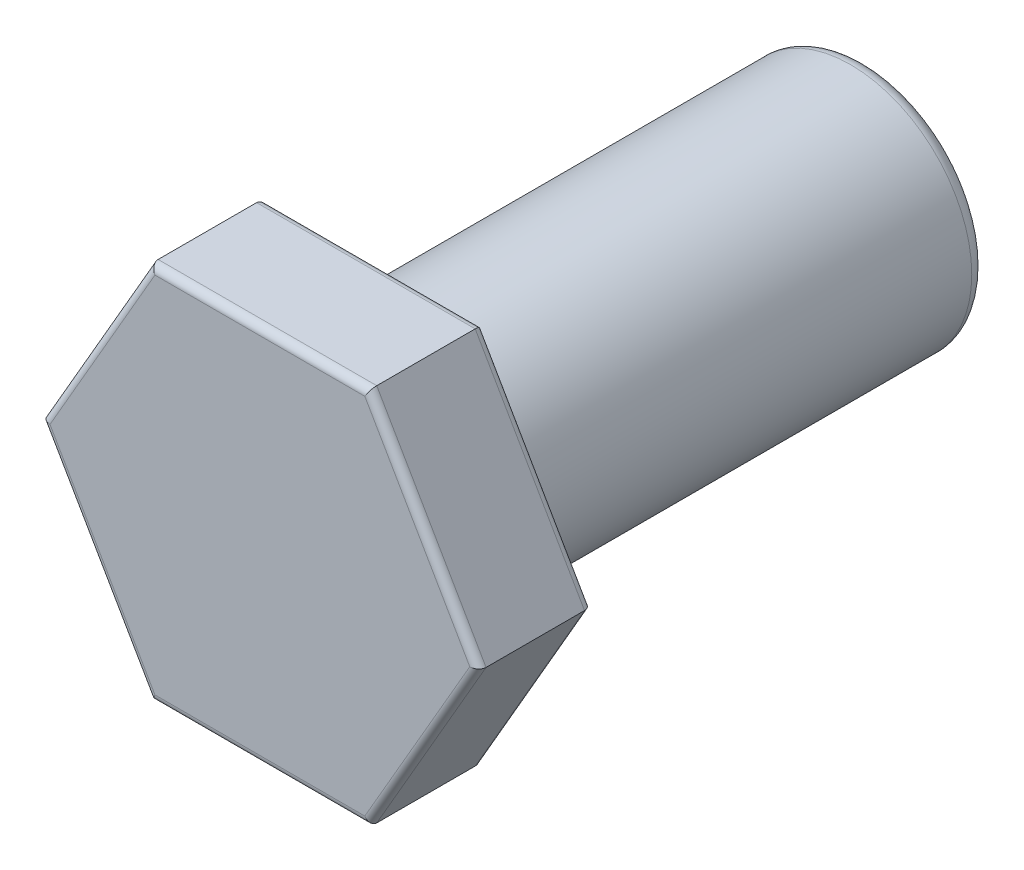
ISO-10303-21;
HEADER;
FILE_DESCRIPTION(('STEP AP214'),'2;1');
FILE_NAME('part.step','',(''),(''),'','','');
FILE_SCHEMA(('AUTOMOTIVE_DESIGN { 1 0 10303 214 1 1 1 1 }'));
ENDSEC;
DATA;
#1=APPLICATION_CONTEXT('core data for automotive mechanical design processes');
#2=APPLICATION_PROTOCOL_DEFINITION('international standard','automotive_design',2000,#1);
#3=PRODUCT_CONTEXT('',#1,'mechanical');
#4=PRODUCT('Part','Part','',(#3));
#5=PRODUCT_RELATED_PRODUCT_CATEGORY('part','',(#4));
#6=PRODUCT_DEFINITION_FORMATION('','',#4);
#7=PRODUCT_DEFINITION_CONTEXT('part definition',#1,'design');
#8=PRODUCT_DEFINITION('design','',#6,#7);
#9=PRODUCT_DEFINITION_SHAPE('','',#8);
#10=(LENGTH_UNIT() NAMED_UNIT(*) SI_UNIT(.MILLI.,.METRE.));
#11=(NAMED_UNIT(*) PLANE_ANGLE_UNIT() SI_UNIT($,.RADIAN.));
#12=(NAMED_UNIT(*) SI_UNIT($,.STERADIAN.) SOLID_ANGLE_UNIT());
#13=UNCERTAINTY_MEASURE_WITH_UNIT(LENGTH_MEASURE(1.E-05),#10,'distance_accuracy_value','');
#14=(GEOMETRIC_REPRESENTATION_CONTEXT(3) GLOBAL_UNCERTAINTY_ASSIGNED_CONTEXT((#13)) GLOBAL_UNIT_ASSIGNED_CONTEXT((#10,
#11,#12)) REPRESENTATION_CONTEXT('',''));
#15=CARTESIAN_POINT('',(0.,0.,0.));
#16=DIRECTION('',(0.,0.,1.));
#17=DIRECTION('',(1.,0.,0.));
#18=AXIS2_PLACEMENT_3D('',#15,#16,#17);
#19=CARTESIAN_POINT('',(0.,0.,32.5));
#20=DIRECTION('',(0.,0.,-1.));
#21=DIRECTION('',(-1.,0.,0.));
#22=AXIS2_PLACEMENT_3D('',#19,#20,#21);
#23=CYLINDRICAL_SURFACE('',#22,8.);
#24=CARTESIAN_POINT('',(0.,0.,1.));
#25=DIRECTION('',(0.,0.,1.));
#26=DIRECTION('',(1.,0.,0.));
#27=AXIS2_PLACEMENT_3D('',#24,#25,#26);
#28=CIRCLE('',#27,8.);
#29=CARTESIAN_POINT('',(8.,0.,1.));
#30=VERTEX_POINT('',#29);
#31=EDGE_CURVE('E155',#30,#30,#28,.T.);
#32=ORIENTED_EDGE('',*,*,#31,.T.);
#33=EDGE_LOOP('',(#32));
#34=FACE_BOUND('',#33,.T.);
#35=CARTESIAN_POINT('',(0.,0.,32.5));
#36=DIRECTION('',(0.,0.,1.));
#37=DIRECTION('',(1.,0.,0.));
#38=AXIS2_PLACEMENT_3D('',#35,#36,#37);
#39=CIRCLE('',#38,8.);
#40=CARTESIAN_POINT('',(8.,0.,32.5));
#41=VERTEX_POINT('',#40);
#42=EDGE_CURVE('E268',#41,#41,#39,.T.);
#43=ORIENTED_EDGE('',*,*,#42,.F.);
#44=EDGE_LOOP('',(#43));
#45=FACE_BOUND('',#44,.T.);
#46=ADVANCED_FACE('F34',(#34,#45),#23,.T.);
#47=CARTESIAN_POINT('',(0.,0.,0.));
#48=DIRECTION('',(0.,0.,1.));
#49=DIRECTION('',(1.,0.,0.));
#50=AXIS2_PLACEMENT_3D('',#47,#48,#49);
#51=PLANE('',#50);
#52=CARTESIAN_POINT('',(0.,0.,0.));
#53=DIRECTION('',(0.,0.,1.));
#54=DIRECTION('',(1.,0.,0.));
#55=AXIS2_PLACEMENT_3D('',#52,#53,#54);
#56=CIRCLE('',#55,7.);
#57=CARTESIAN_POINT('',(7.,0.,0.));
#58=VERTEX_POINT('',#57);
#59=EDGE_CURVE('E151',#58,#58,#56,.F.);
#60=ORIENTED_EDGE('',*,*,#59,.T.);
#61=EDGE_LOOP('',(#60));
#62=FACE_BOUND('',#61,.T.);
#63=ADVANCED_FACE('F289',(#62),#51,.F.);
#64=CARTESIAN_POINT('',(0.,0.,32.5));
#65=DIRECTION('',(0.,0.,1.));
#66=DIRECTION('',(1.,0.,0.));
#67=AXIS2_PLACEMENT_3D('',#64,#65,#66);
#68=PLANE('',#67);
#69=DIRECTION('',(0.5,0.866025403784439,0.));
#70=VECTOR('',#69,1.);
#71=CARTESIAN_POINT('',(10.3923048454133,-6.00000000000001,32.5));
#72=LINE('',#71,#70);
#73=CARTESIAN_POINT('',(13.856406460551,0.,32.5));
#74=VERTEX_POINT('',#73);
#75=CARTESIAN_POINT('',(6.92820323027551,-12.,32.5));
#76=VERTEX_POINT('',#75);
#77=EDGE_CURVE('E183',#74,#76,#72,.F.);
#78=ORIENTED_EDGE('',*,*,#77,.T.);
#79=DIRECTION('',(1.,0.,0.));
#80=VECTOR('',#79,1.);
#81=CARTESIAN_POINT('',(0.,-12.,32.5));
#82=LINE('',#81,#80);
#83=CARTESIAN_POINT('',(-6.92820323027552,-12.,32.5));
#84=VERTEX_POINT('',#83);
#85=EDGE_CURVE('E189',#76,#84,#82,.F.);
#86=ORIENTED_EDGE('',*,*,#85,.T.);
#87=DIRECTION('',(0.5,-0.866025403784439,0.));
#88=VECTOR('',#87,1.);
#89=CARTESIAN_POINT('',(-10.3923048454133,-6.,32.5));
#90=LINE('',#89,#88);
#91=CARTESIAN_POINT('',(-13.856406460551,0.,32.5));
#92=VERTEX_POINT('',#91);
#93=EDGE_CURVE('E187',#84,#92,#90,.F.);
#94=ORIENTED_EDGE('',*,*,#93,.T.);
#95=DIRECTION('',(-0.5,-0.866025403784439,0.));
#96=VECTOR('',#95,1.);
#97=CARTESIAN_POINT('',(-10.3923048454133,6.00000000000001,32.5));
#98=LINE('',#97,#96);
#99=CARTESIAN_POINT('',(-6.92820323027552,12.,32.5));
#100=VERTEX_POINT('',#99);
#101=EDGE_CURVE('E185',#92,#100,#98,.F.);
#102=ORIENTED_EDGE('',*,*,#101,.T.);
#103=DIRECTION('',(-1.,0.,0.));
#104=VECTOR('',#103,1.);
#105=CARTESIAN_POINT('',(0.,12.,32.5));
#106=LINE('',#105,#104);
#107=CARTESIAN_POINT('',(6.92820323027551,12.,32.5));
#108=VERTEX_POINT('',#107);
#109=EDGE_CURVE('E181',#100,#108,#106,.F.);
#110=ORIENTED_EDGE('',*,*,#109,.T.);
#111=DIRECTION('',(-0.5,0.866025403784439,0.));
#112=VECTOR('',#111,1.);
#113=CARTESIAN_POINT('',(10.3923048454133,6.,32.5));
#114=LINE('',#113,#112);
#115=EDGE_CURVE('E179',#108,#74,#114,.F.);
#116=ORIENTED_EDGE('',*,*,#115,.T.);
#117=EDGE_LOOP('',(#78,#86,#94,#102,#110,#116));
#118=FACE_BOUND('',#117,.T.);
#119=ORIENTED_EDGE('',*,*,#42,.T.);
#120=EDGE_LOOP('',(#119));
#121=FACE_BOUND('',#120,.T.);
#122=ADVANCED_FACE('F233',(#118,#121),#68,.F.);
#123=CARTESIAN_POINT('',(-7.21687836487033,-12.5,40.));
#124=DIRECTION('',(0.,1.,0.));
#125=DIRECTION('',(-1.,0.,0.));
#126=AXIS2_PLACEMENT_3D('',#123,#124,#125);
#127=PLANE('',#126);
#128=DIRECTION('',(0.,0.,-1.));
#129=VECTOR('',#128,1.);
#130=CARTESIAN_POINT('',(7.21687836487032,-12.5,40.));
#131=LINE('',#130,#129);
#132=CARTESIAN_POINT('',(7.21687836487032,-12.5,39.5));
#133=VERTEX_POINT('',#132);
#134=CARTESIAN_POINT('',(7.21687836487032,-12.5,33.));
#135=VERTEX_POINT('',#134);
#136=EDGE_CURVE('E266',#133,#135,#131,.T.);
#137=ORIENTED_EDGE('',*,*,#136,.F.);
#138=DIRECTION('',(1.,0.,0.));
#139=VECTOR('',#138,1.);
#140=CARTESIAN_POINT('',(-7.21687836487033,-12.5,39.5));
#141=LINE('',#140,#139);
#142=CARTESIAN_POINT('',(-7.21687836487033,-12.5,39.5));
#143=VERTEX_POINT('',#142);
#144=EDGE_CURVE('E177',#133,#143,#141,.F.);
#145=ORIENTED_EDGE('',*,*,#144,.T.);
#146=DIRECTION('',(0.,0.,-1.));
#147=VECTOR('',#146,1.);
#148=CARTESIAN_POINT('',(-7.21687836487033,-12.5,40.));
#149=LINE('',#148,#147);
#150=CARTESIAN_POINT('',(-7.21687836487033,-12.5,33.));
#151=VERTEX_POINT('',#150);
#152=EDGE_CURVE('E144',#143,#151,#149,.T.);
#153=ORIENTED_EDGE('',*,*,#152,.T.);
#154=DIRECTION('',(1.,0.,0.));
#155=VECTOR('',#154,1.);
#156=CARTESIAN_POINT('',(-7.21687836487033,-12.5,33.));
#157=LINE('',#156,#155);
#158=EDGE_CURVE('E174',#151,#135,#157,.T.);
#159=ORIENTED_EDGE('',*,*,#158,.T.);
#160=EDGE_LOOP('',(#137,#145,#153,#159));
#161=FACE_BOUND('',#160,.T.);
#162=ADVANCED_FACE('F253',(#161),#127,.F.);
#163=CARTESIAN_POINT('',(7.21687836487032,-12.5,40.));
#164=DIRECTION('',(-0.866025403784438,0.5,0.));
#165=DIRECTION('',(-0.5,-0.866025403784439,0.));
#166=AXIS2_PLACEMENT_3D('',#163,#164,#165);
#167=PLANE('',#166);
#168=DIRECTION('',(0.,0.,-1.));
#169=VECTOR('',#168,1.);
#170=CARTESIAN_POINT('',(14.4337567297407,0.,40.));
#171=LINE('',#170,#169);
#172=CARTESIAN_POINT('',(14.4337567297407,0.,39.5));
#173=VERTEX_POINT('',#172);
#174=CARTESIAN_POINT('',(14.4337567297407,0.,33.));
#175=VERTEX_POINT('',#174);
#176=EDGE_CURVE('E264',#173,#175,#171,.T.);
#177=ORIENTED_EDGE('',*,*,#176,.F.);
#178=DIRECTION('',(0.5,0.866025403784439,0.));
#179=VECTOR('',#178,1.);
#180=CARTESIAN_POINT('',(7.21687836487032,-12.5,39.5));
#181=LINE('',#180,#179);
#182=EDGE_CURVE('E141',#173,#133,#181,.F.);
#183=ORIENTED_EDGE('',*,*,#182,.T.);
#184=ORIENTED_EDGE('',*,*,#136,.T.);
#185=DIRECTION('',(0.5,0.866025403784439,0.));
#186=VECTOR('',#185,1.);
#187=CARTESIAN_POINT('',(7.21687836487032,-12.5,33.));
#188=LINE('',#187,#186);
#189=EDGE_CURVE('E192',#135,#175,#188,.T.);
#190=ORIENTED_EDGE('',*,*,#189,.T.);
#191=EDGE_LOOP('',(#177,#183,#184,#190));
#192=FACE_BOUND('',#191,.T.);
#193=ADVANCED_FACE('F298',(#192),#167,.F.);
#194=CARTESIAN_POINT('',(14.4337567297407,0.,40.));
#195=DIRECTION('',(-0.866025403784438,-0.5,0.));
#196=DIRECTION('',(0.5,-0.866025403784439,0.));
#197=AXIS2_PLACEMENT_3D('',#194,#195,#196);
#198=PLANE('',#197);
#199=ORIENTED_EDGE('',*,*,#176,.T.);
#200=DIRECTION('',(-0.5,0.866025403784439,0.));
#201=VECTOR('',#200,1.);
#202=CARTESIAN_POINT('',(14.4337567297407,0.,33.));
#203=LINE('',#202,#201);
#204=CARTESIAN_POINT('',(7.21687836487033,12.5,33.));
#205=VERTEX_POINT('',#204);
#206=EDGE_CURVE('E11',#175,#205,#203,.T.);
#207=ORIENTED_EDGE('',*,*,#206,.T.);
#208=DIRECTION('',(0.,0.,-1.));
#209=VECTOR('',#208,1.);
#210=CARTESIAN_POINT('',(7.21687836487033,12.5,40.));
#211=LINE('',#210,#209);
#212=CARTESIAN_POINT('',(7.21687836487033,12.5,39.5));
#213=VERTEX_POINT('',#212);
#214=EDGE_CURVE('E262',#213,#205,#211,.T.);
#215=ORIENTED_EDGE('',*,*,#214,.F.);
#216=DIRECTION('',(-0.5,0.866025403784439,0.));
#217=VECTOR('',#216,1.);
#218=CARTESIAN_POINT('',(14.4337567297407,0.,39.5));
#219=LINE('',#218,#217);
#220=EDGE_CURVE('E43',#213,#173,#219,.F.);
#221=ORIENTED_EDGE('',*,*,#220,.T.);
#222=EDGE_LOOP('',(#199,#207,#215,#221));
#223=FACE_BOUND('',#222,.T.);
#224=ADVANCED_FACE('F301',(#223),#198,.F.);
#225=CARTESIAN_POINT('',(7.21687836487033,12.5,40.));
#226=DIRECTION('',(0.,-1.,0.));
#227=DIRECTION('',(1.,0.,0.));
#228=AXIS2_PLACEMENT_3D('',#225,#226,#227);
#229=PLANE('',#228);
#230=DIRECTION('',(0.,0.,-1.));
#231=VECTOR('',#230,1.);
#232=CARTESIAN_POINT('',(-7.21687836487033,12.5,40.));
#233=LINE('',#232,#231);
#234=CARTESIAN_POINT('',(-7.21687836487033,12.5,39.5));
#235=VERTEX_POINT('',#234);
#236=CARTESIAN_POINT('',(-7.21687836487033,12.5,33.));
#237=VERTEX_POINT('',#236);
#238=EDGE_CURVE('E257',#235,#237,#233,.T.);
#239=ORIENTED_EDGE('',*,*,#238,.F.);
#240=DIRECTION('',(-1.,0.,0.));
#241=VECTOR('',#240,1.);
#242=CARTESIAN_POINT('',(7.21687836487033,12.5,39.5));
#243=LINE('',#242,#241);
#244=EDGE_CURVE('E56',#235,#213,#243,.F.);
#245=ORIENTED_EDGE('',*,*,#244,.T.);
#246=ORIENTED_EDGE('',*,*,#214,.T.);
#247=DIRECTION('',(-1.,0.,0.));
#248=VECTOR('',#247,1.);
#249=CARTESIAN_POINT('',(7.21687836487033,12.5,33.));
#250=LINE('',#249,#248);
#251=EDGE_CURVE('E195',#205,#237,#250,.T.);
#252=ORIENTED_EDGE('',*,*,#251,.T.);
#253=EDGE_LOOP('',(#239,#245,#246,#252));
#254=FACE_BOUND('',#253,.T.);
#255=ADVANCED_FACE('F305',(#254),#229,.F.);
#256=CARTESIAN_POINT('',(-7.21687836487033,12.5,40.));
#257=DIRECTION('',(0.866025403784438,-0.5,0.));
#258=DIRECTION('',(0.5,0.866025403784439,0.));
#259=AXIS2_PLACEMENT_3D('',#256,#257,#258);
#260=PLANE('',#259);
#261=DIRECTION('',(0.,0.,-1.));
#262=VECTOR('',#261,1.);
#263=CARTESIAN_POINT('',(-14.4337567297407,0.,40.));
#264=LINE('',#263,#262);
#265=CARTESIAN_POINT('',(-14.4337567297407,0.,39.5));
#266=VERTEX_POINT('',#265);
#267=CARTESIAN_POINT('',(-14.4337567297407,0.,33.));
#268=VERTEX_POINT('',#267);
#269=EDGE_CURVE('E250',#266,#268,#264,.T.);
#270=ORIENTED_EDGE('',*,*,#269,.F.);
#271=DIRECTION('',(-0.5,-0.866025403784439,0.));
#272=VECTOR('',#271,1.);
#273=CARTESIAN_POINT('',(-7.21687836487033,12.5,39.5));
#274=LINE('',#273,#272);
#275=EDGE_CURVE('E167',#266,#235,#274,.F.);
#276=ORIENTED_EDGE('',*,*,#275,.T.);
#277=ORIENTED_EDGE('',*,*,#238,.T.);
#278=DIRECTION('',(-0.5,-0.866025403784439,0.));
#279=VECTOR('',#278,1.);
#280=CARTESIAN_POINT('',(-7.21687836487033,12.5,33.));
#281=LINE('',#280,#279);
#282=EDGE_CURVE('E165',#237,#268,#281,.T.);
#283=ORIENTED_EDGE('',*,*,#282,.T.);
#284=EDGE_LOOP('',(#270,#276,#277,#283));
#285=FACE_BOUND('',#284,.T.);
#286=ADVANCED_FACE('F308',(#285),#260,.F.);
#287=CARTESIAN_POINT('',(-14.4337567297407,0.,40.));
#288=DIRECTION('',(0.866025403784439,0.5,0.));
#289=DIRECTION('',(-0.5,0.866025403784439,0.));
#290=AXIS2_PLACEMENT_3D('',#287,#288,#289);
#291=PLANE('',#290);
#292=ORIENTED_EDGE('',*,*,#152,.F.);
#293=DIRECTION('',(0.5,-0.866025403784439,0.));
#294=VECTOR('',#293,1.);
#295=CARTESIAN_POINT('',(-14.4337567297407,0.,39.5));
#296=LINE('',#295,#294);
#297=EDGE_CURVE('E172',#143,#266,#296,.F.);
#298=ORIENTED_EDGE('',*,*,#297,.T.);
#299=ORIENTED_EDGE('',*,*,#269,.T.);
#300=DIRECTION('',(0.5,-0.866025403784439,0.));
#301=VECTOR('',#300,1.);
#302=CARTESIAN_POINT('',(-14.4337567297407,0.,33.));
#303=LINE('',#302,#301);
#304=EDGE_CURVE('E170',#268,#151,#303,.T.);
#305=ORIENTED_EDGE('',*,*,#304,.T.);
#306=EDGE_LOOP('',(#292,#298,#299,#305));
#307=FACE_BOUND('',#306,.T.);
#308=ADVANCED_FACE('F247',(#307),#291,.F.);
#309=CARTESIAN_POINT('',(0.,0.,40.));
#310=DIRECTION('',(0.,0.,1.));
#311=DIRECTION('',(1.,0.,0.));
#312=AXIS2_PLACEMENT_3D('',#309,#310,#311);
#313=PLANE('',#312);
#314=DIRECTION('',(-1.,0.,0.));
#315=VECTOR('',#314,1.);
#316=CARTESIAN_POINT('',(-7.21687836487033,12.,40.));
#317=LINE('',#316,#315);
#318=CARTESIAN_POINT('',(6.92820323027551,12.,40.));
#319=VERTEX_POINT('',#318);
#320=CARTESIAN_POINT('',(-6.92820323027552,12.,40.));
#321=VERTEX_POINT('',#320);
#322=EDGE_CURVE('E135',#319,#321,#317,.T.);
#323=ORIENTED_EDGE('',*,*,#322,.T.);
#324=DIRECTION('',(-0.5,-0.866025403784439,0.));
#325=VECTOR('',#324,1.);
#326=CARTESIAN_POINT('',(-14.0007440278484,-0.25,40.));
#327=LINE('',#326,#325);
#328=CARTESIAN_POINT('',(-13.856406460551,0.,40.));
#329=VERTEX_POINT('',#328);
#330=EDGE_CURVE('E162',#321,#329,#327,.T.);
#331=ORIENTED_EDGE('',*,*,#330,.T.);
#332=DIRECTION('',(0.5,-0.866025403784439,0.));
#333=VECTOR('',#332,1.);
#334=CARTESIAN_POINT('',(-6.78386566297811,-12.25,40.));
#335=LINE('',#334,#333);
#336=CARTESIAN_POINT('',(-6.92820323027552,-12.,40.));
#337=VERTEX_POINT('',#336);
#338=EDGE_CURVE('E160',#329,#337,#335,.T.);
#339=ORIENTED_EDGE('',*,*,#338,.T.);
#340=DIRECTION('',(1.,0.,0.));
#341=VECTOR('',#340,1.);
#342=CARTESIAN_POINT('',(7.21687836487032,-12.,40.));
#343=LINE('',#342,#341);
#344=CARTESIAN_POINT('',(6.92820323027551,-12.,40.));
#345=VERTEX_POINT('',#344);
#346=EDGE_CURVE('E131',#337,#345,#343,.T.);
#347=ORIENTED_EDGE('',*,*,#346,.T.);
#348=DIRECTION('',(0.5,0.866025403784439,0.));
#349=VECTOR('',#348,1.);
#350=CARTESIAN_POINT('',(14.0007440278484,0.249999999999999,40.));
#351=LINE('',#350,#349);
#352=CARTESIAN_POINT('',(13.856406460551,0.,40.));
#353=VERTEX_POINT('',#352);
#354=EDGE_CURVE('E124',#345,#353,#351,.T.);
#355=ORIENTED_EDGE('',*,*,#354,.T.);
#356=DIRECTION('',(-0.5,0.866025403784439,0.));
#357=VECTOR('',#356,1.);
#358=CARTESIAN_POINT('',(6.78386566297811,12.25,40.));
#359=LINE('',#358,#357);
#360=EDGE_CURVE('E128',#353,#319,#359,.T.);
#361=ORIENTED_EDGE('',*,*,#360,.T.);
#362=EDGE_LOOP('',(#323,#331,#339,#347,#355,#361));
#363=FACE_BOUND('',#362,.T.);
#364=ADVANCED_FACE('F126',(#363),#313,.T.);
#365=CARTESIAN_POINT('',(0.,0.,1.));
#366=DIRECTION('',(0.,0.,1.));
#367=DIRECTION('',(1.,0.,0.));
#368=AXIS2_PLACEMENT_3D('',#365,#366,#367);
#369=TOROIDAL_SURFACE('',#368,7.,1.);
#370=ORIENTED_EDGE('',*,*,#59,.F.);
#371=EDGE_LOOP('',(#370));
#372=FACE_BOUND('',#371,.T.);
#373=ORIENTED_EDGE('',*,*,#31,.F.);
#374=EDGE_LOOP('',(#373));
#375=FACE_BOUND('',#374,.T.);
#376=ADVANCED_FACE('F275',(#372,#375),#369,.T.);
#377=CARTESIAN_POINT('',(10.3923048454133,-6.00000000000001,39.5));
#378=DIRECTION('',(-0.5,-0.866025403784439,0.));
#379=DIRECTION('',(0.866025403784438,-0.5,0.));
#380=AXIS2_PLACEMENT_3D('',#377,#378,#379);
#381=CYLINDRICAL_SURFACE('',#380,0.5);
#382=CARTESIAN_POINT('',(6.92820323027551,-12.,39.5));
#383=DIRECTION('',(-0.866025403784439,-0.5,0.));
#384=DIRECTION('',(0.5,-0.866025403784439,0.));
#385=AXIS2_PLACEMENT_3D('',#382,#383,#384);
#386=ELLIPSE('',#385,0.577350269189626,0.5);
#387=EDGE_CURVE('E145',#133,#345,#386,.T.);
#388=ORIENTED_EDGE('',*,*,#387,.F.);
#389=ORIENTED_EDGE('',*,*,#182,.F.);
#390=CARTESIAN_POINT('',(13.856406460551,0.,39.5));
#391=DIRECTION('',(0.,-1.,0.));
#392=DIRECTION('',(1.,0.,0.));
#393=AXIS2_PLACEMENT_3D('',#390,#391,#392);
#394=ELLIPSE('',#393,0.577350269189626,0.5);
#395=EDGE_CURVE('E139',#353,#173,#394,.F.);
#396=ORIENTED_EDGE('',*,*,#395,.F.);
#397=ORIENTED_EDGE('',*,*,#354,.F.);
#398=EDGE_LOOP('',(#388,#389,#396,#397));
#399=FACE_BOUND('',#398,.T.);
#400=ADVANCED_FACE('F140',(#399),#381,.T.);
#401=CARTESIAN_POINT('',(10.3923048454133,6.,39.5));
#402=DIRECTION('',(0.5,-0.866025403784439,0.));
#403=DIRECTION('',(0.866025403784439,0.5,0.));
#404=AXIS2_PLACEMENT_3D('',#401,#402,#403);
#405=CYLINDRICAL_SURFACE('',#404,0.5);
#406=ORIENTED_EDGE('',*,*,#395,.T.);
#407=ORIENTED_EDGE('',*,*,#220,.F.);
#408=CARTESIAN_POINT('',(6.92820323027551,12.,39.5));
#409=DIRECTION('',(0.866025403784439,-0.5,0.));
#410=DIRECTION('',(-0.5,-0.866025403784439,0.));
#411=AXIS2_PLACEMENT_3D('',#408,#409,#410);
#412=ELLIPSE('',#411,0.577350269189626,0.5);
#413=EDGE_CURVE('E149',#319,#213,#412,.F.);
#414=ORIENTED_EDGE('',*,*,#413,.F.);
#415=ORIENTED_EDGE('',*,*,#360,.F.);
#416=EDGE_LOOP('',(#406,#407,#414,#415));
#417=FACE_BOUND('',#416,.T.);
#418=ADVANCED_FACE('F147',(#417),#405,.T.);
#419=CARTESIAN_POINT('',(0.,-12.,39.5));
#420=DIRECTION('',(-1.,0.,0.));
#421=DIRECTION('',(0.,-1.,0.));
#422=AXIS2_PLACEMENT_3D('',#419,#420,#421);
#423=CYLINDRICAL_SURFACE('',#422,0.5);
#424=ORIENTED_EDGE('',*,*,#387,.T.);
#425=ORIENTED_EDGE('',*,*,#346,.F.);
#426=CARTESIAN_POINT('',(-6.92820323027551,-12.,39.5));
#427=DIRECTION('',(-0.866025403784438,0.5,0.));
#428=DIRECTION('',(-0.5,-0.866025403784439,0.));
#429=AXIS2_PLACEMENT_3D('',#426,#427,#428);
#430=ELLIPSE('',#429,0.577350269189626,0.5);
#431=EDGE_CURVE('E203',#143,#337,#430,.T.);
#432=ORIENTED_EDGE('',*,*,#431,.F.);
#433=ORIENTED_EDGE('',*,*,#144,.F.);
#434=EDGE_LOOP('',(#424,#425,#432,#433));
#435=FACE_BOUND('',#434,.T.);
#436=ADVANCED_FACE('F363',(#435),#423,.T.);
#437=CARTESIAN_POINT('',(0.,12.,39.5));
#438=DIRECTION('',(1.,0.,0.));
#439=DIRECTION('',(0.,1.,0.));
#440=AXIS2_PLACEMENT_3D('',#437,#438,#439);
#441=CYLINDRICAL_SURFACE('',#440,0.5);
#442=ORIENTED_EDGE('',*,*,#413,.T.);
#443=ORIENTED_EDGE('',*,*,#244,.F.);
#444=CARTESIAN_POINT('',(-6.92820323027552,12.,39.5));
#445=DIRECTION('',(0.866025403784439,0.5,0.));
#446=DIRECTION('',(0.5,-0.866025403784439,0.));
#447=AXIS2_PLACEMENT_3D('',#444,#445,#446);
#448=ELLIPSE('',#447,0.577350269189626,0.5);
#449=EDGE_CURVE('E201',#321,#235,#448,.F.);
#450=ORIENTED_EDGE('',*,*,#449,.F.);
#451=ORIENTED_EDGE('',*,*,#322,.F.);
#452=EDGE_LOOP('',(#442,#443,#450,#451));
#453=FACE_BOUND('',#452,.T.);
#454=ADVANCED_FACE('F372',(#453),#441,.T.);
#455=CARTESIAN_POINT('',(-10.3923048454133,-6.,39.5));
#456=DIRECTION('',(-0.5,0.866025403784439,0.));
#457=DIRECTION('',(-0.866025403784439,-0.5,0.));
#458=AXIS2_PLACEMENT_3D('',#455,#456,#457);
#459=CYLINDRICAL_SURFACE('',#458,0.5);
#460=ORIENTED_EDGE('',*,*,#431,.T.);
#461=ORIENTED_EDGE('',*,*,#338,.F.);
#462=CARTESIAN_POINT('',(-13.856406460551,0.,39.5));
#463=DIRECTION('',(0.,1.,0.));
#464=DIRECTION('',(-1.,0.,0.));
#465=AXIS2_PLACEMENT_3D('',#462,#463,#464);
#466=ELLIPSE('',#465,0.577350269189626,0.5);
#467=EDGE_CURVE('E199',#266,#329,#466,.T.);
#468=ORIENTED_EDGE('',*,*,#467,.F.);
#469=ORIENTED_EDGE('',*,*,#297,.F.);
#470=EDGE_LOOP('',(#460,#461,#468,#469));
#471=FACE_BOUND('',#470,.T.);
#472=ADVANCED_FACE('F382',(#471),#459,.T.);
#473=CARTESIAN_POINT('',(-10.3923048454133,6.00000000000001,39.5));
#474=DIRECTION('',(0.5,0.866025403784439,0.));
#475=DIRECTION('',(-0.866025403784439,0.5,0.));
#476=AXIS2_PLACEMENT_3D('',#473,#474,#475);
#477=CYLINDRICAL_SURFACE('',#476,0.5);
#478=ORIENTED_EDGE('',*,*,#449,.T.);
#479=ORIENTED_EDGE('',*,*,#275,.F.);
#480=ORIENTED_EDGE('',*,*,#467,.T.);
#481=ORIENTED_EDGE('',*,*,#330,.F.);
#482=EDGE_LOOP('',(#478,#479,#480,#481));
#483=FACE_BOUND('',#482,.T.);
#484=ADVANCED_FACE('F392',(#483),#477,.T.);
#485=CARTESIAN_POINT('',(7.21687836487033,12.,33.));
#486=DIRECTION('',(-1.,0.,0.));
#487=DIRECTION('',(0.,-1.,0.));
#488=AXIS2_PLACEMENT_3D('',#485,#486,#487);
#489=CYLINDRICAL_SURFACE('',#488,0.5);
#490=CARTESIAN_POINT('',(6.92820323027551,12.,33.));
#491=DIRECTION('',(-0.866025403784439,0.5,0.));
#492=DIRECTION('',(0.5,0.866025403784439,0.));
#493=AXIS2_PLACEMENT_3D('',#490,#491,#492);
#494=ELLIPSE('',#493,0.577350269189626,0.5);
#495=EDGE_CURVE('E217',#108,#205,#494,.F.);
#496=ORIENTED_EDGE('',*,*,#495,.F.);
#497=ORIENTED_EDGE('',*,*,#109,.F.);
#498=CARTESIAN_POINT('',(-6.92820323027551,12.,33.));
#499=DIRECTION('',(-0.866025403784439,-0.5,0.));
#500=DIRECTION('',(-0.5,0.866025403784439,0.));
#501=AXIS2_PLACEMENT_3D('',#498,#499,#500);
#502=ELLIPSE('',#501,0.577350269189626,0.5);
#503=EDGE_CURVE('E38',#237,#100,#502,.T.);
#504=ORIENTED_EDGE('',*,*,#503,.F.);
#505=ORIENTED_EDGE('',*,*,#251,.F.);
#506=EDGE_LOOP('',(#496,#497,#504,#505));
#507=FACE_BOUND('',#506,.T.);
#508=ADVANCED_FACE('F36',(#507),#489,.T.);
#509=CARTESIAN_POINT('',(-6.78386566297811,12.25,33.));
#510=DIRECTION('',(-0.5,-0.866025403784439,0.));
#511=DIRECTION('',(0.866025403784439,-0.5,0.));
#512=AXIS2_PLACEMENT_3D('',#509,#510,#511);
#513=CYLINDRICAL_SURFACE('',#512,0.5);
#514=ORIENTED_EDGE('',*,*,#503,.T.);
#515=ORIENTED_EDGE('',*,*,#101,.F.);
#516=CARTESIAN_POINT('',(-13.856406460551,0.,33.));
#517=DIRECTION('',(0.,-1.,0.));
#518=DIRECTION('',(-1.,0.,0.));
#519=AXIS2_PLACEMENT_3D('',#516,#517,#518);
#520=ELLIPSE('',#519,0.577350269189626,0.5);
#521=EDGE_CURVE('E215',#268,#92,#520,.T.);
#522=ORIENTED_EDGE('',*,*,#521,.F.);
#523=ORIENTED_EDGE('',*,*,#282,.F.);
#524=EDGE_LOOP('',(#514,#515,#522,#523));
#525=FACE_BOUND('',#524,.T.);
#526=ADVANCED_FACE('F227',(#525),#513,.T.);
#527=CARTESIAN_POINT('',(14.0007440278484,-0.250000000000004,33.));
#528=DIRECTION('',(-0.5,0.866025403784439,0.));
#529=DIRECTION('',(-0.866025403784439,-0.5,0.));
#530=AXIS2_PLACEMENT_3D('',#527,#528,#529);
#531=CYLINDRICAL_SURFACE('',#530,0.5);
#532=ORIENTED_EDGE('',*,*,#495,.T.);
#533=ORIENTED_EDGE('',*,*,#206,.F.);
#534=CARTESIAN_POINT('',(13.856406460551,0.,33.));
#535=DIRECTION('',(0.,1.,0.));
#536=DIRECTION('',(-1.,0.,0.));
#537=AXIS2_PLACEMENT_3D('',#534,#535,#536);
#538=ELLIPSE('',#537,0.577350269189626,0.5);
#539=EDGE_CURVE('E212',#74,#175,#538,.F.);
#540=ORIENTED_EDGE('',*,*,#539,.F.);
#541=ORIENTED_EDGE('',*,*,#115,.F.);
#542=EDGE_LOOP('',(#532,#533,#540,#541));
#543=FACE_BOUND('',#542,.T.);
#544=ADVANCED_FACE('F417',(#543),#531,.T.);
#545=CARTESIAN_POINT('',(-14.0007440278484,0.250000000000002,33.));
#546=DIRECTION('',(0.5,-0.866025403784439,0.));
#547=DIRECTION('',(0.866025403784439,0.5,0.));
#548=AXIS2_PLACEMENT_3D('',#545,#546,#547);
#549=CYLINDRICAL_SURFACE('',#548,0.5);
#550=ORIENTED_EDGE('',*,*,#521,.T.);
#551=ORIENTED_EDGE('',*,*,#93,.F.);
#552=CARTESIAN_POINT('',(-6.92820323027552,-12.,33.));
#553=DIRECTION('',(0.866025403784438,-0.5,0.));
#554=DIRECTION('',(-0.5,-0.866025403784439,0.));
#555=AXIS2_PLACEMENT_3D('',#552,#553,#554);
#556=ELLIPSE('',#555,0.577350269189626,0.5);
#557=EDGE_CURVE('E210',#151,#84,#556,.T.);
#558=ORIENTED_EDGE('',*,*,#557,.F.);
#559=ORIENTED_EDGE('',*,*,#304,.F.);
#560=EDGE_LOOP('',(#550,#551,#558,#559));
#561=FACE_BOUND('',#560,.T.);
#562=ADVANCED_FACE('F240',(#561),#549,.T.);
#563=CARTESIAN_POINT('',(6.7838656629781,-12.25,33.));
#564=DIRECTION('',(0.5,0.866025403784439,0.));
#565=DIRECTION('',(-0.866025403784438,0.5,0.));
#566=AXIS2_PLACEMENT_3D('',#563,#564,#565);
#567=CYLINDRICAL_SURFACE('',#566,0.5);
#568=ORIENTED_EDGE('',*,*,#539,.T.);
#569=ORIENTED_EDGE('',*,*,#189,.F.);
#570=CARTESIAN_POINT('',(6.92820323027551,-12.,33.));
#571=DIRECTION('',(0.866025403784439,0.5,0.));
#572=DIRECTION('',(-0.5,0.866025403784439,0.));
#573=AXIS2_PLACEMENT_3D('',#570,#571,#572);
#574=ELLIPSE('',#573,0.577350269189626,0.5);
#575=EDGE_CURVE('E208',#76,#135,#574,.F.);
#576=ORIENTED_EDGE('',*,*,#575,.F.);
#577=ORIENTED_EDGE('',*,*,#77,.F.);
#578=EDGE_LOOP('',(#568,#569,#576,#577));
#579=FACE_BOUND('',#578,.T.);
#580=ADVANCED_FACE('F433',(#579),#567,.T.);
#581=CARTESIAN_POINT('',(-7.21687836487033,-12.,33.));
#582=DIRECTION('',(1.,0.,0.));
#583=DIRECTION('',(0.,1.,0.));
#584=AXIS2_PLACEMENT_3D('',#581,#582,#583);
#585=CYLINDRICAL_SURFACE('',#584,0.5);
#586=ORIENTED_EDGE('',*,*,#557,.T.);
#587=ORIENTED_EDGE('',*,*,#85,.F.);
#588=ORIENTED_EDGE('',*,*,#575,.T.);
#589=ORIENTED_EDGE('',*,*,#158,.F.);
#590=EDGE_LOOP('',(#586,#587,#588,#589));
#591=FACE_BOUND('',#590,.T.);
#592=ADVANCED_FACE('F442',(#591),#585,.T.);
#593=CLOSED_SHELL('',(#46,#63,#122,#162,#193,#224,#255,#286,#308,#364,#376,#400,#418,#436,#454,
#472,#484,#508,#526,#544,#562,#580,#592));
#594=MANIFOLD_SOLID_BREP('B2',#593);
#595=ADVANCED_BREP_SHAPE_REPRESENTATION('',(#18,#594),#14);
#596=SHAPE_DEFINITION_REPRESENTATION(#9,#595);
ENDSEC;
END-ISO-10303-21;
